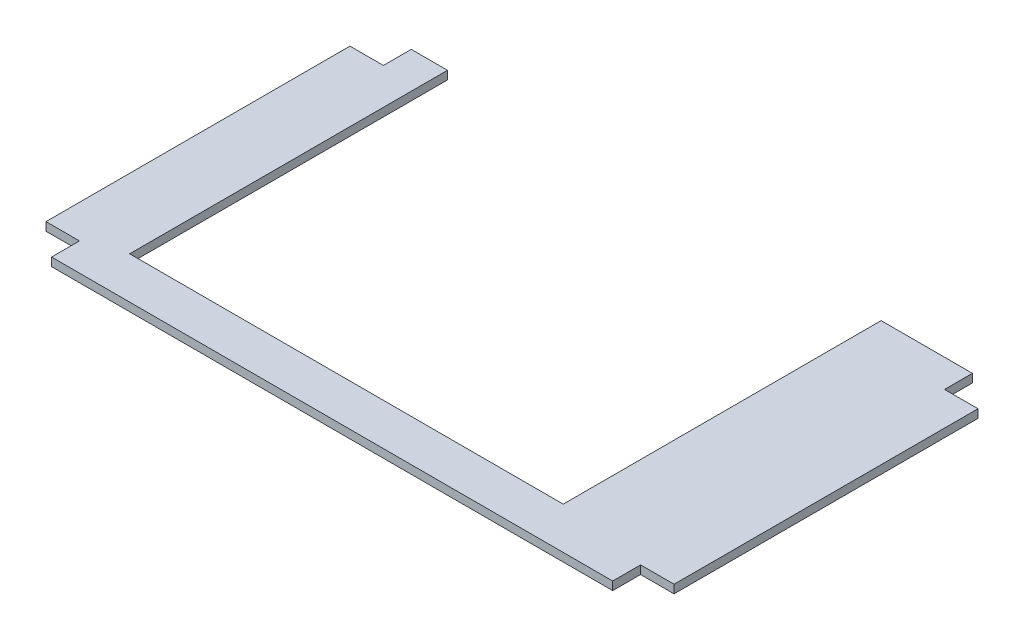
ISO-10303-21;
HEADER;
FILE_DESCRIPTION(('STEP AP214'),'2;1');
FILE_NAME('part.step','',(''),(''),'','','');
FILE_SCHEMA(('AUTOMOTIVE_DESIGN { 1 0 10303 214 1 1 1 1 }'));
ENDSEC;
DATA;
#1=APPLICATION_CONTEXT('core data for automotive mechanical design processes');
#2=APPLICATION_PROTOCOL_DEFINITION('international standard','automotive_design',2000,#1);
#3=PRODUCT_CONTEXT('',#1,'mechanical');
#4=PRODUCT('Part','Part','',(#3));
#5=PRODUCT_RELATED_PRODUCT_CATEGORY('part','',(#4));
#6=PRODUCT_DEFINITION_FORMATION('','',#4);
#7=PRODUCT_DEFINITION_CONTEXT('part definition',#1,'design');
#8=PRODUCT_DEFINITION('design','',#6,#7);
#9=PRODUCT_DEFINITION_SHAPE('','',#8);
#10=(LENGTH_UNIT() NAMED_UNIT(*) SI_UNIT(.MILLI.,.METRE.));
#11=(NAMED_UNIT(*) PLANE_ANGLE_UNIT() SI_UNIT($,.RADIAN.));
#12=(NAMED_UNIT(*) SI_UNIT($,.STERADIAN.) SOLID_ANGLE_UNIT());
#13=UNCERTAINTY_MEASURE_WITH_UNIT(LENGTH_MEASURE(1.E-05),#10,'distance_accuracy_value','');
#14=(GEOMETRIC_REPRESENTATION_CONTEXT(3) GLOBAL_UNCERTAINTY_ASSIGNED_CONTEXT((#13)) GLOBAL_UNIT_ASSIGNED_CONTEXT((#10,
#11,#12)) REPRESENTATION_CONTEXT('',''));
#15=CARTESIAN_POINT('',(0.,0.,0.));
#16=DIRECTION('',(0.,0.,1.));
#17=DIRECTION('',(1.,0.,0.));
#18=AXIS2_PLACEMENT_3D('',#15,#16,#17);
#19=CARTESIAN_POINT('',(112.62,3.,-129.));
#20=DIRECTION('',(0.,0.,1.));
#21=DIRECTION('',(1.,0.,0.));
#22=AXIS2_PLACEMENT_3D('',#19,#20,#21);
#23=PLANE('',#22);
#24=DIRECTION('',(-1.,0.,0.));
#25=VECTOR('',#24,1.);
#26=CARTESIAN_POINT('',(112.62,3.,-129.));
#27=LINE('',#26,#25);
#28=CARTESIAN_POINT('',(-87.62,3.,-129.));
#29=VERTEX_POINT('',#28);
#30=CARTESIAN_POINT('',(-100.62,3.,-129.));
#31=VERTEX_POINT('',#30);
#32=EDGE_CURVE('E191',#29,#31,#27,.T.);
#33=ORIENTED_EDGE('',*,*,#32,.F.);
#34=DIRECTION('',(0.,1.,0.));
#35=VECTOR('',#34,1.);
#36=CARTESIAN_POINT('',(-87.62,0.,-129.));
#37=LINE('',#36,#35);
#38=CARTESIAN_POINT('',(-87.62,0.,-129.));
#39=VERTEX_POINT('',#38);
#40=EDGE_CURVE('E240',#39,#29,#37,.T.);
#41=ORIENTED_EDGE('',*,*,#40,.F.);
#42=DIRECTION('',(-1.,0.,0.));
#43=VECTOR('',#42,1.);
#44=CARTESIAN_POINT('',(112.62,0.,-129.));
#45=LINE('',#44,#43);
#46=CARTESIAN_POINT('',(-100.62,0.,-129.));
#47=VERTEX_POINT('',#46);
#48=EDGE_CURVE('E177',#39,#47,#45,.T.);
#49=ORIENTED_EDGE('',*,*,#48,.T.);
#50=DIRECTION('',(0.,1.,0.));
#51=VECTOR('',#50,1.);
#52=CARTESIAN_POINT('',(-100.62,0.,-129.));
#53=LINE('',#52,#51);
#54=EDGE_CURVE('E183',#47,#31,#53,.T.);
#55=ORIENTED_EDGE('',*,*,#54,.T.);
#56=EDGE_LOOP('',(#33,#41,#49,#55));
#57=FACE_BOUND('',#56,.T.);
#58=ADVANCED_FACE('F37',(#57),#23,.F.);
#59=CARTESIAN_POINT('',(100.62,0.,-129.));
#60=VERTEX_POINT('',#59);
#61=CARTESIAN_POINT('',(67.88,0.,-129.));
#62=VERTEX_POINT('',#61);
#63=EDGE_CURVE('E169',#60,#62,#45,.T.);
#64=ORIENTED_EDGE('',*,*,#63,.T.);
#65=DIRECTION('',(0.,1.,0.));
#66=VECTOR('',#65,1.);
#67=CARTESIAN_POINT('',(67.88,0.,-129.));
#68=LINE('',#67,#66);
#69=CARTESIAN_POINT('',(67.88,3.,-129.));
#70=VERTEX_POINT('',#69);
#71=EDGE_CURVE('E265',#62,#70,#68,.T.);
#72=ORIENTED_EDGE('',*,*,#71,.T.);
#73=CARTESIAN_POINT('',(100.62,3.,-129.));
#74=VERTEX_POINT('',#73);
#75=EDGE_CURVE('E171',#74,#70,#27,.T.);
#76=ORIENTED_EDGE('',*,*,#75,.F.);
#77=DIRECTION('',(0.,1.,0.));
#78=VECTOR('',#77,1.);
#79=CARTESIAN_POINT('',(100.62,0.,-129.));
#80=LINE('',#79,#78);
#81=EDGE_CURVE('E156',#60,#74,#80,.T.);
#82=ORIENTED_EDGE('',*,*,#81,.F.);
#83=EDGE_LOOP('',(#64,#72,#76,#82));
#84=FACE_BOUND('',#83,.T.);
#85=ADVANCED_FACE('F39',(#84),#23,.F.);
#86=CARTESIAN_POINT('',(-112.62,3.,-129.));
#87=DIRECTION('',(1.,0.,0.));
#88=DIRECTION('',(0.,0.,-1.));
#89=AXIS2_PLACEMENT_3D('',#86,#87,#88);
#90=PLANE('',#89);
#91=DIRECTION('',(0.,0.,1.));
#92=VECTOR('',#91,1.);
#93=CARTESIAN_POINT('',(-112.62,0.,-129.));
#94=LINE('',#93,#92);
#95=CARTESIAN_POINT('',(-112.62,0.,-119.));
#96=VERTEX_POINT('',#95);
#97=CARTESIAN_POINT('',(-112.62,0.,-9.99999999999997));
#98=VERTEX_POINT('',#97);
#99=EDGE_CURVE('E176',#96,#98,#94,.T.);
#100=ORIENTED_EDGE('',*,*,#99,.T.);
#101=DIRECTION('',(0.,1.,0.));
#102=VECTOR('',#101,1.);
#103=CARTESIAN_POINT('',(-112.62,0.,-9.99999999999997));
#104=LINE('',#103,#102);
#105=CARTESIAN_POINT('',(-112.62,3.,-9.99999999999997));
#106=VERTEX_POINT('',#105);
#107=EDGE_CURVE('E242',#98,#106,#104,.T.);
#108=ORIENTED_EDGE('',*,*,#107,.T.);
#109=DIRECTION('',(0.,0.,1.));
#110=VECTOR('',#109,1.);
#111=CARTESIAN_POINT('',(-112.62,3.,-129.));
#112=LINE('',#111,#110);
#113=CARTESIAN_POINT('',(-112.62,3.,-119.));
#114=VERTEX_POINT('',#113);
#115=EDGE_CURVE('E202',#114,#106,#112,.T.);
#116=ORIENTED_EDGE('',*,*,#115,.F.);
#117=DIRECTION('',(0.,1.,0.));
#118=VECTOR('',#117,1.);
#119=CARTESIAN_POINT('',(-112.62,0.,-119.));
#120=LINE('',#119,#118);
#121=EDGE_CURVE('E205',#96,#114,#120,.T.);
#122=ORIENTED_EDGE('',*,*,#121,.F.);
#123=EDGE_LOOP('',(#100,#108,#116,#122));
#124=FACE_BOUND('',#123,.T.);
#125=ADVANCED_FACE('F293',(#124),#90,.F.);
#126=CARTESIAN_POINT('',(-112.62,3.,0.));
#127=DIRECTION('',(0.,0.,-1.));
#128=DIRECTION('',(-1.,0.,0.));
#129=AXIS2_PLACEMENT_3D('',#126,#127,#128);
#130=PLANE('',#129);
#131=DIRECTION('',(1.,0.,0.));
#132=VECTOR('',#131,1.);
#133=CARTESIAN_POINT('',(-112.62,3.,0.));
#134=LINE('',#133,#132);
#135=CARTESIAN_POINT('',(-100.62,3.,0.));
#136=VERTEX_POINT('',#135);
#137=CARTESIAN_POINT('',(100.62,3.,0.));
#138=VERTEX_POINT('',#137);
#139=EDGE_CURVE('E46',#136,#138,#134,.T.);
#140=ORIENTED_EDGE('',*,*,#139,.F.);
#141=DIRECTION('',(0.,1.,0.));
#142=VECTOR('',#141,1.);
#143=CARTESIAN_POINT('',(-100.62,0.,0.));
#144=LINE('',#143,#142);
#145=CARTESIAN_POINT('',(-100.62,0.,0.));
#146=VERTEX_POINT('',#145);
#147=EDGE_CURVE('E219',#146,#136,#144,.T.);
#148=ORIENTED_EDGE('',*,*,#147,.F.);
#149=DIRECTION('',(1.,0.,0.));
#150=VECTOR('',#149,1.);
#151=CARTESIAN_POINT('',(-112.62,0.,0.));
#152=LINE('',#151,#150);
#153=CARTESIAN_POINT('',(100.62,0.,0.));
#154=VERTEX_POINT('',#153);
#155=EDGE_CURVE('E180',#146,#154,#152,.T.);
#156=ORIENTED_EDGE('',*,*,#155,.T.);
#157=DIRECTION('',(0.,1.,0.));
#158=VECTOR('',#157,1.);
#159=CARTESIAN_POINT('',(100.62,0.,0.));
#160=LINE('',#159,#158);
#161=EDGE_CURVE('E220',#154,#138,#160,.T.);
#162=ORIENTED_EDGE('',*,*,#161,.T.);
#163=EDGE_LOOP('',(#140,#148,#156,#162));
#164=FACE_BOUND('',#163,.T.);
#165=ADVANCED_FACE('F218',(#164),#130,.F.);
#166=CARTESIAN_POINT('',(112.62,3.,0.));
#167=DIRECTION('',(-1.,0.,0.));
#168=DIRECTION('',(0.,0.,1.));
#169=AXIS2_PLACEMENT_3D('',#166,#167,#168);
#170=PLANE('',#169);
#171=DIRECTION('',(0.,0.,-1.));
#172=VECTOR('',#171,1.);
#173=CARTESIAN_POINT('',(112.62,3.,0.));
#174=LINE('',#173,#172);
#175=CARTESIAN_POINT('',(112.62,3.,-9.99999999999999));
#176=VERTEX_POINT('',#175);
#177=CARTESIAN_POINT('',(112.62,3.,-119.));
#178=VERTEX_POINT('',#177);
#179=EDGE_CURVE('E11',#176,#178,#174,.T.);
#180=ORIENTED_EDGE('',*,*,#179,.F.);
#181=DIRECTION('',(0.,1.,0.));
#182=VECTOR('',#181,1.);
#183=CARTESIAN_POINT('',(112.62,0.,-9.99999999999999));
#184=LINE('',#183,#182);
#185=CARTESIAN_POINT('',(112.62,0.,-9.99999999999999));
#186=VERTEX_POINT('',#185);
#187=EDGE_CURVE('E227',#186,#176,#184,.T.);
#188=ORIENTED_EDGE('',*,*,#187,.F.);
#189=DIRECTION('',(0.,0.,-1.));
#190=VECTOR('',#189,1.);
#191=CARTESIAN_POINT('',(112.62,0.,0.));
#192=LINE('',#191,#190);
#193=CARTESIAN_POINT('',(112.62,0.,-119.));
#194=VERTEX_POINT('',#193);
#195=EDGE_CURVE('E41',#186,#194,#192,.T.);
#196=ORIENTED_EDGE('',*,*,#195,.T.);
#197=DIRECTION('',(0.,1.,0.));
#198=VECTOR('',#197,1.);
#199=CARTESIAN_POINT('',(112.62,0.,-119.));
#200=LINE('',#199,#198);
#201=EDGE_CURVE('E280',#194,#178,#200,.T.);
#202=ORIENTED_EDGE('',*,*,#201,.T.);
#203=EDGE_LOOP('',(#180,#188,#196,#202));
#204=FACE_BOUND('',#203,.T.);
#205=ADVANCED_FACE('F338',(#204),#170,.F.);
#206=CARTESIAN_POINT('',(0.,3.,0.));
#207=DIRECTION('',(0.,1.,0.));
#208=DIRECTION('',(0.,0.,1.));
#209=AXIS2_PLACEMENT_3D('',#206,#207,#208);
#210=PLANE('',#209);
#211=DIRECTION('',(0.,0.,1.));
#212=VECTOR('',#211,1.);
#213=CARTESIAN_POINT('',(-87.62,3.,-129.));
#214=LINE('',#213,#212);
#215=CARTESIAN_POINT('',(-87.62,3.,-15.));
#216=VERTEX_POINT('',#215);
#217=EDGE_CURVE('E257',#29,#216,#214,.T.);
#218=ORIENTED_EDGE('',*,*,#217,.F.);
#219=ORIENTED_EDGE('',*,*,#32,.T.);
#220=DIRECTION('',(0.,0.,-1.));
#221=VECTOR('',#220,1.);
#222=CARTESIAN_POINT('',(-100.62,3.,-129.));
#223=LINE('',#222,#221);
#224=CARTESIAN_POINT('',(-100.62,3.,-119.));
#225=VERTEX_POINT('',#224);
#226=EDGE_CURVE('E274',#225,#31,#223,.T.);
#227=ORIENTED_EDGE('',*,*,#226,.F.);
#228=DIRECTION('',(1.,0.,0.));
#229=VECTOR('',#228,1.);
#230=CARTESIAN_POINT('',(-112.62,3.,-119.));
#231=LINE('',#230,#229);
#232=EDGE_CURVE('E277',#114,#225,#231,.T.);
#233=ORIENTED_EDGE('',*,*,#232,.F.);
#234=ORIENTED_EDGE('',*,*,#115,.T.);
#235=DIRECTION('',(-1.,0.,0.));
#236=VECTOR('',#235,1.);
#237=CARTESIAN_POINT('',(-112.62,3.,-9.99999999999997));
#238=LINE('',#237,#236);
#239=CARTESIAN_POINT('',(-100.62,3.,-9.99999999999997));
#240=VERTEX_POINT('',#239);
#241=EDGE_CURVE('E237',#240,#106,#238,.T.);
#242=ORIENTED_EDGE('',*,*,#241,.F.);
#243=DIRECTION('',(0.,0.,-1.));
#244=VECTOR('',#243,1.);
#245=CARTESIAN_POINT('',(-100.62,3.,0.));
#246=LINE('',#245,#244);
#247=EDGE_CURVE('E217',#136,#240,#246,.T.);
#248=ORIENTED_EDGE('',*,*,#247,.F.);
#249=ORIENTED_EDGE('',*,*,#139,.T.);
#250=DIRECTION('',(0.,0.,1.));
#251=VECTOR('',#250,1.);
#252=CARTESIAN_POINT('',(100.62,3.,0.));
#253=LINE('',#252,#251);
#254=CARTESIAN_POINT('',(100.62,3.,-9.99999999999999));
#255=VERTEX_POINT('',#254);
#256=EDGE_CURVE('E214',#255,#138,#253,.T.);
#257=ORIENTED_EDGE('',*,*,#256,.F.);
#258=DIRECTION('',(-1.,0.,0.));
#259=VECTOR('',#258,1.);
#260=CARTESIAN_POINT('',(112.62,3.,-9.99999999999999));
#261=LINE('',#260,#259);
#262=EDGE_CURVE('E245',#176,#255,#261,.T.);
#263=ORIENTED_EDGE('',*,*,#262,.F.);
#264=ORIENTED_EDGE('',*,*,#179,.T.);
#265=DIRECTION('',(1.,0.,0.));
#266=VECTOR('',#265,1.);
#267=CARTESIAN_POINT('',(112.62,3.,-119.));
#268=LINE('',#267,#266);
#269=CARTESIAN_POINT('',(100.62,3.,-119.));
#270=VERTEX_POINT('',#269);
#271=EDGE_CURVE('E163',#270,#178,#268,.T.);
#272=ORIENTED_EDGE('',*,*,#271,.F.);
#273=DIRECTION('',(0.,0.,1.));
#274=VECTOR('',#273,1.);
#275=CARTESIAN_POINT('',(100.62,3.,-129.));
#276=LINE('',#275,#274);
#277=EDGE_CURVE('E223',#74,#270,#276,.T.);
#278=ORIENTED_EDGE('',*,*,#277,.F.);
#279=ORIENTED_EDGE('',*,*,#75,.T.);
#280=DIRECTION('',(0.,0.,-1.));
#281=VECTOR('',#280,1.);
#282=CARTESIAN_POINT('',(67.88,3.,-129.));
#283=LINE('',#282,#281);
#284=CARTESIAN_POINT('',(67.88,3.,-15.));
#285=VERTEX_POINT('',#284);
#286=EDGE_CURVE('E253',#285,#70,#283,.T.);
#287=ORIENTED_EDGE('',*,*,#286,.F.);
#288=DIRECTION('',(1.,0.,0.));
#289=VECTOR('',#288,1.);
#290=CARTESIAN_POINT('',(-87.62,3.,-15.));
#291=LINE('',#290,#289);
#292=EDGE_CURVE('E260',#216,#285,#291,.T.);
#293=ORIENTED_EDGE('',*,*,#292,.F.);
#294=EDGE_LOOP('',(#218,#219,#227,#233,#234,#242,#248,#249,#257,#263,#264,#272,#278,#279,#287,#293));
#295=FACE_BOUND('',#294,.T.);
#296=ADVANCED_FACE('F212',(#295),#210,.T.);
#297=CARTESIAN_POINT('',(0.,0.,0.));
#298=DIRECTION('',(0.,1.,0.));
#299=DIRECTION('',(0.,0.,1.));
#300=AXIS2_PLACEMENT_3D('',#297,#298,#299);
#301=PLANE('',#300);
#302=ORIENTED_EDGE('',*,*,#48,.F.);
#303=DIRECTION('',(0.,0.,1.));
#304=VECTOR('',#303,1.);
#305=CARTESIAN_POINT('',(-87.62,0.,-129.));
#306=LINE('',#305,#304);
#307=CARTESIAN_POINT('',(-87.62,0.,-15.));
#308=VERTEX_POINT('',#307);
#309=EDGE_CURVE('E249',#39,#308,#306,.T.);
#310=ORIENTED_EDGE('',*,*,#309,.T.);
#311=DIRECTION('',(1.,0.,0.));
#312=VECTOR('',#311,1.);
#313=CARTESIAN_POINT('',(-87.62,0.,-15.));
#314=LINE('',#313,#312);
#315=CARTESIAN_POINT('',(67.88,0.,-15.));
#316=VERTEX_POINT('',#315);
#317=EDGE_CURVE('E252',#308,#316,#314,.T.);
#318=ORIENTED_EDGE('',*,*,#317,.T.);
#319=DIRECTION('',(0.,0.,-1.));
#320=VECTOR('',#319,1.);
#321=CARTESIAN_POINT('',(67.88,0.,-129.));
#322=LINE('',#321,#320);
#323=EDGE_CURVE('E54',#316,#62,#322,.T.);
#324=ORIENTED_EDGE('',*,*,#323,.T.);
#325=ORIENTED_EDGE('',*,*,#63,.F.);
#326=DIRECTION('',(0.,0.,1.));
#327=VECTOR('',#326,1.);
#328=CARTESIAN_POINT('',(100.62,0.,-129.));
#329=LINE('',#328,#327);
#330=CARTESIAN_POINT('',(100.62,0.,-119.));
#331=VERTEX_POINT('',#330);
#332=EDGE_CURVE('E152',#60,#331,#329,.T.);
#333=ORIENTED_EDGE('',*,*,#332,.T.);
#334=DIRECTION('',(1.,0.,0.));
#335=VECTOR('',#334,1.);
#336=CARTESIAN_POINT('',(112.62,0.,-119.));
#337=LINE('',#336,#335);
#338=EDGE_CURVE('E162',#331,#194,#337,.T.);
#339=ORIENTED_EDGE('',*,*,#338,.T.);
#340=ORIENTED_EDGE('',*,*,#195,.F.);
#341=DIRECTION('',(-1.,0.,0.));
#342=VECTOR('',#341,1.);
#343=CARTESIAN_POINT('',(112.62,0.,-9.99999999999999));
#344=LINE('',#343,#342);
#345=CARTESIAN_POINT('',(100.62,0.,-9.99999999999999));
#346=VERTEX_POINT('',#345);
#347=EDGE_CURVE('E330',#186,#346,#344,.T.);
#348=ORIENTED_EDGE('',*,*,#347,.T.);
#349=DIRECTION('',(0.,0.,1.));
#350=VECTOR('',#349,1.);
#351=CARTESIAN_POINT('',(100.62,0.,0.));
#352=LINE('',#351,#350);
#353=EDGE_CURVE('E233',#346,#154,#352,.T.);
#354=ORIENTED_EDGE('',*,*,#353,.T.);
#355=ORIENTED_EDGE('',*,*,#155,.F.);
#356=DIRECTION('',(0.,0.,-1.));
#357=VECTOR('',#356,1.);
#358=CARTESIAN_POINT('',(-100.62,0.,0.));
#359=LINE('',#358,#357);
#360=CARTESIAN_POINT('',(-100.62,0.,-9.99999999999997));
#361=VERTEX_POINT('',#360);
#362=EDGE_CURVE('E234',#146,#361,#359,.T.);
#363=ORIENTED_EDGE('',*,*,#362,.T.);
#364=DIRECTION('',(-1.,0.,0.));
#365=VECTOR('',#364,1.);
#366=CARTESIAN_POINT('',(-112.62,0.,-9.99999999999997));
#367=LINE('',#366,#365);
#368=EDGE_CURVE('E62',#361,#98,#367,.T.);
#369=ORIENTED_EDGE('',*,*,#368,.T.);
#370=ORIENTED_EDGE('',*,*,#99,.F.);
#371=DIRECTION('',(1.,0.,0.));
#372=VECTOR('',#371,1.);
#373=CARTESIAN_POINT('',(-112.62,0.,-119.));
#374=LINE('',#373,#372);
#375=CARTESIAN_POINT('',(-100.62,0.,-119.));
#376=VERTEX_POINT('',#375);
#377=EDGE_CURVE('E270',#96,#376,#374,.T.);
#378=ORIENTED_EDGE('',*,*,#377,.T.);
#379=DIRECTION('',(0.,0.,-1.));
#380=VECTOR('',#379,1.);
#381=CARTESIAN_POINT('',(-100.62,0.,-129.));
#382=LINE('',#381,#380);
#383=EDGE_CURVE('E273',#376,#47,#382,.T.);
#384=ORIENTED_EDGE('',*,*,#383,.T.);
#385=EDGE_LOOP('',(#302,#310,#318,#324,#325,#333,#339,#340,#348,#354,#355,#363,#369,#370,#378,#384));
#386=FACE_BOUND('',#385,.T.);
#387=ADVANCED_FACE('F174',(#386),#301,.F.);
#388=CARTESIAN_POINT('',(-100.62,0.,-129.));
#389=DIRECTION('',(1.,0.,0.));
#390=DIRECTION('',(0.,0.,-1.));
#391=AXIS2_PLACEMENT_3D('',#388,#389,#390);
#392=PLANE('',#391);
#393=ORIENTED_EDGE('',*,*,#226,.T.);
#394=ORIENTED_EDGE('',*,*,#54,.F.);
#395=ORIENTED_EDGE('',*,*,#383,.F.);
#396=DIRECTION('',(0.,1.,0.));
#397=VECTOR('',#396,1.);
#398=CARTESIAN_POINT('',(-100.62,0.,-119.));
#399=LINE('',#398,#397);
#400=EDGE_CURVE('E283',#376,#225,#399,.T.);
#401=ORIENTED_EDGE('',*,*,#400,.T.);
#402=EDGE_LOOP('',(#393,#394,#395,#401));
#403=FACE_BOUND('',#402,.T.);
#404=ADVANCED_FACE('F316',(#403),#392,.F.);
#405=CARTESIAN_POINT('',(-112.62,0.,-119.));
#406=DIRECTION('',(0.,0.,1.));
#407=DIRECTION('',(1.,0.,0.));
#408=AXIS2_PLACEMENT_3D('',#405,#406,#407);
#409=PLANE('',#408);
#410=ORIENTED_EDGE('',*,*,#232,.T.);
#411=ORIENTED_EDGE('',*,*,#400,.F.);
#412=ORIENTED_EDGE('',*,*,#377,.F.);
#413=ORIENTED_EDGE('',*,*,#121,.T.);
#414=EDGE_LOOP('',(#410,#411,#412,#413));
#415=FACE_BOUND('',#414,.T.);
#416=ADVANCED_FACE('F289',(#415),#409,.F.);
#417=CARTESIAN_POINT('',(112.62,0.,-119.));
#418=DIRECTION('',(0.,0.,1.));
#419=DIRECTION('',(1.,0.,0.));
#420=AXIS2_PLACEMENT_3D('',#417,#418,#419);
#421=PLANE('',#420);
#422=ORIENTED_EDGE('',*,*,#271,.T.);
#423=ORIENTED_EDGE('',*,*,#201,.F.);
#424=ORIENTED_EDGE('',*,*,#338,.F.);
#425=DIRECTION('',(0.,1.,0.));
#426=VECTOR('',#425,1.);
#427=CARTESIAN_POINT('',(100.62,0.,-119.));
#428=LINE('',#427,#426);
#429=EDGE_CURVE('E158',#331,#270,#428,.T.);
#430=ORIENTED_EDGE('',*,*,#429,.T.);
#431=EDGE_LOOP('',(#422,#423,#424,#430));
#432=FACE_BOUND('',#431,.T.);
#433=ADVANCED_FACE('F337',(#432),#421,.F.);
#434=CARTESIAN_POINT('',(100.62,0.,-129.));
#435=DIRECTION('',(-1.,0.,0.));
#436=DIRECTION('',(0.,0.,1.));
#437=AXIS2_PLACEMENT_3D('',#434,#435,#436);
#438=PLANE('',#437);
#439=ORIENTED_EDGE('',*,*,#277,.T.);
#440=ORIENTED_EDGE('',*,*,#429,.F.);
#441=ORIENTED_EDGE('',*,*,#332,.F.);
#442=ORIENTED_EDGE('',*,*,#81,.T.);
#443=EDGE_LOOP('',(#439,#440,#441,#442));
#444=FACE_BOUND('',#443,.T.);
#445=ADVANCED_FACE('F155',(#444),#438,.F.);
#446=CARTESIAN_POINT('',(100.62,0.,0.));
#447=DIRECTION('',(-1.,0.,0.));
#448=DIRECTION('',(0.,0.,1.));
#449=AXIS2_PLACEMENT_3D('',#446,#447,#448);
#450=PLANE('',#449);
#451=ORIENTED_EDGE('',*,*,#256,.T.);
#452=ORIENTED_EDGE('',*,*,#161,.F.);
#453=ORIENTED_EDGE('',*,*,#353,.F.);
#454=DIRECTION('',(0.,1.,0.));
#455=VECTOR('',#454,1.);
#456=CARTESIAN_POINT('',(100.62,0.,-9.99999999999999));
#457=LINE('',#456,#455);
#458=EDGE_CURVE('E224',#346,#255,#457,.T.);
#459=ORIENTED_EDGE('',*,*,#458,.T.);
#460=EDGE_LOOP('',(#451,#452,#453,#459));
#461=FACE_BOUND('',#460,.T.);
#462=ADVANCED_FACE('F336',(#461),#450,.F.);
#463=CARTESIAN_POINT('',(112.62,0.,-9.99999999999999));
#464=DIRECTION('',(0.,0.,-1.));
#465=DIRECTION('',(-1.,0.,0.));
#466=AXIS2_PLACEMENT_3D('',#463,#464,#465);
#467=PLANE('',#466);
#468=ORIENTED_EDGE('',*,*,#262,.T.);
#469=ORIENTED_EDGE('',*,*,#458,.F.);
#470=ORIENTED_EDGE('',*,*,#347,.F.);
#471=ORIENTED_EDGE('',*,*,#187,.T.);
#472=EDGE_LOOP('',(#468,#469,#470,#471));
#473=FACE_BOUND('',#472,.T.);
#474=ADVANCED_FACE('F307',(#473),#467,.F.);
#475=CARTESIAN_POINT('',(-112.62,0.,-9.99999999999997));
#476=DIRECTION('',(0.,0.,-1.));
#477=DIRECTION('',(-1.,0.,0.));
#478=AXIS2_PLACEMENT_3D('',#475,#476,#477);
#479=PLANE('',#478);
#480=ORIENTED_EDGE('',*,*,#241,.T.);
#481=ORIENTED_EDGE('',*,*,#107,.F.);
#482=ORIENTED_EDGE('',*,*,#368,.F.);
#483=DIRECTION('',(0.,1.,0.));
#484=VECTOR('',#483,1.);
#485=CARTESIAN_POINT('',(-100.62,0.,-9.99999999999997));
#486=LINE('',#485,#484);
#487=EDGE_CURVE('E246',#361,#240,#486,.T.);
#488=ORIENTED_EDGE('',*,*,#487,.T.);
#489=EDGE_LOOP('',(#480,#481,#482,#488));
#490=FACE_BOUND('',#489,.T.);
#491=ADVANCED_FACE('F294',(#490),#479,.F.);
#492=CARTESIAN_POINT('',(-100.62,0.,0.));
#493=DIRECTION('',(1.,0.,0.));
#494=DIRECTION('',(0.,0.,-1.));
#495=AXIS2_PLACEMENT_3D('',#492,#493,#494);
#496=PLANE('',#495);
#497=ORIENTED_EDGE('',*,*,#247,.T.);
#498=ORIENTED_EDGE('',*,*,#487,.F.);
#499=ORIENTED_EDGE('',*,*,#362,.F.);
#500=ORIENTED_EDGE('',*,*,#147,.T.);
#501=EDGE_LOOP('',(#497,#498,#499,#500));
#502=FACE_BOUND('',#501,.T.);
#503=ADVANCED_FACE('F296',(#502),#496,.F.);
#504=CARTESIAN_POINT('',(-87.62,0.,-129.));
#505=DIRECTION('',(-1.,0.,0.));
#506=DIRECTION('',(0.,0.,1.));
#507=AXIS2_PLACEMENT_3D('',#504,#505,#506);
#508=PLANE('',#507);
#509=ORIENTED_EDGE('',*,*,#217,.T.);
#510=DIRECTION('',(0.,1.,0.));
#511=VECTOR('',#510,1.);
#512=CARTESIAN_POINT('',(-87.62,0.,-15.));
#513=LINE('',#512,#511);
#514=EDGE_CURVE('E256',#308,#216,#513,.T.);
#515=ORIENTED_EDGE('',*,*,#514,.F.);
#516=ORIENTED_EDGE('',*,*,#309,.F.);
#517=ORIENTED_EDGE('',*,*,#40,.T.);
#518=EDGE_LOOP('',(#509,#515,#516,#517));
#519=FACE_BOUND('',#518,.T.);
#520=ADVANCED_FACE('F298',(#519),#508,.F.);
#521=CARTESIAN_POINT('',(67.88,0.,-129.));
#522=DIRECTION('',(1.,0.,0.));
#523=DIRECTION('',(0.,0.,-1.));
#524=AXIS2_PLACEMENT_3D('',#521,#522,#523);
#525=PLANE('',#524);
#526=ORIENTED_EDGE('',*,*,#286,.T.);
#527=ORIENTED_EDGE('',*,*,#71,.F.);
#528=ORIENTED_EDGE('',*,*,#323,.F.);
#529=DIRECTION('',(0.,1.,0.));
#530=VECTOR('',#529,1.);
#531=CARTESIAN_POINT('',(67.88,0.,-15.));
#532=LINE('',#531,#530);
#533=EDGE_CURVE('E267',#316,#285,#532,.T.);
#534=ORIENTED_EDGE('',*,*,#533,.T.);
#535=EDGE_LOOP('',(#526,#527,#528,#534));
#536=FACE_BOUND('',#535,.T.);
#537=ADVANCED_FACE('F304',(#536),#525,.F.);
#538=CARTESIAN_POINT('',(-87.62,0.,-15.));
#539=DIRECTION('',(0.,0.,1.));
#540=DIRECTION('',(1.,0.,0.));
#541=AXIS2_PLACEMENT_3D('',#538,#539,#540);
#542=PLANE('',#541);
#543=ORIENTED_EDGE('',*,*,#292,.T.);
#544=ORIENTED_EDGE('',*,*,#533,.F.);
#545=ORIENTED_EDGE('',*,*,#317,.F.);
#546=ORIENTED_EDGE('',*,*,#514,.T.);
#547=EDGE_LOOP('',(#543,#544,#545,#546));
#548=FACE_BOUND('',#547,.T.);
#549=ADVANCED_FACE('F320',(#548),#542,.F.);
#550=CLOSED_SHELL('',(#58,#85,#125,#165,#205,#296,#387,#404,#416,#433,#445,#462,#474,#491,#503,
#520,#537,#549));
#551=MANIFOLD_SOLID_BREP('B2',#550);
#552=ADVANCED_BREP_SHAPE_REPRESENTATION('',(#18,#551),#14);
#553=SHAPE_DEFINITION_REPRESENTATION(#9,#552);
ENDSEC;
END-ISO-10303-21;
